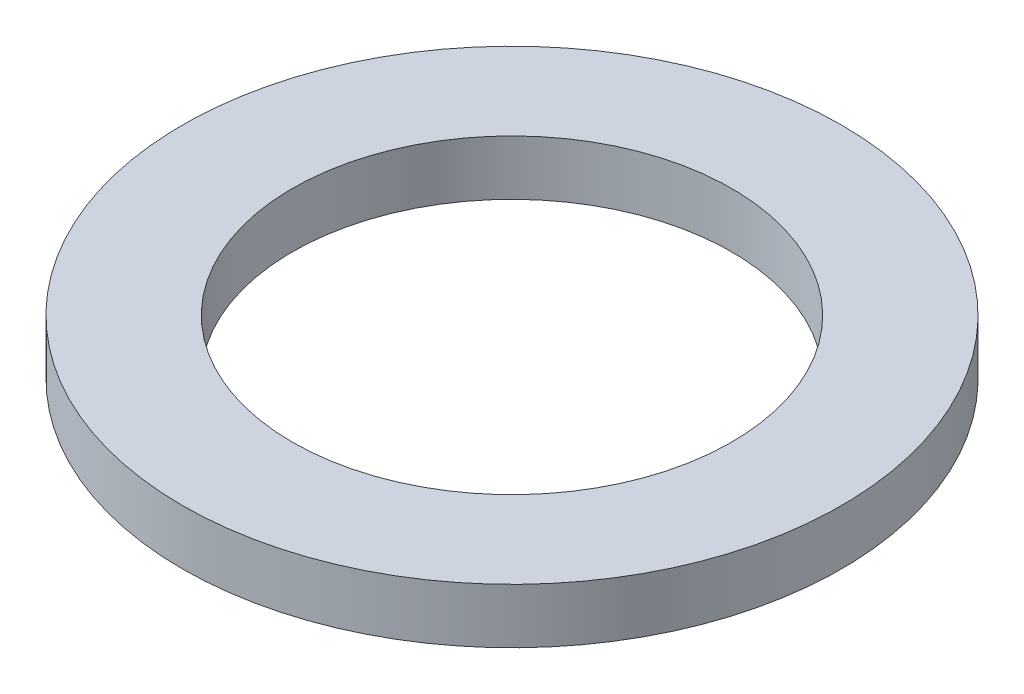
ISO-10303-21;
HEADER;
FILE_DESCRIPTION(('STEP AP214'),'2;1');
FILE_NAME('part.step','',(''),(''),'','','');
FILE_SCHEMA(('AUTOMOTIVE_DESIGN { 1 0 10303 214 1 1 1 1 }'));
ENDSEC;
DATA;
#1=APPLICATION_CONTEXT('core data for automotive mechanical design processes');
#2=APPLICATION_PROTOCOL_DEFINITION('international standard','automotive_design',2000,#1);
#3=PRODUCT_CONTEXT('',#1,'mechanical');
#4=PRODUCT('Part','Part','',(#3));
#5=PRODUCT_RELATED_PRODUCT_CATEGORY('part','',(#4));
#6=PRODUCT_DEFINITION_FORMATION('','',#4);
#7=PRODUCT_DEFINITION_CONTEXT('part definition',#1,'design');
#8=PRODUCT_DEFINITION('design','',#6,#7);
#9=PRODUCT_DEFINITION_SHAPE('','',#8);
#10=(LENGTH_UNIT() NAMED_UNIT(*) SI_UNIT(.MILLI.,.METRE.));
#11=(NAMED_UNIT(*) PLANE_ANGLE_UNIT() SI_UNIT($,.RADIAN.));
#12=(NAMED_UNIT(*) SI_UNIT($,.STERADIAN.) SOLID_ANGLE_UNIT());
#13=UNCERTAINTY_MEASURE_WITH_UNIT(LENGTH_MEASURE(1.E-05),#10,'distance_accuracy_value','');
#14=(GEOMETRIC_REPRESENTATION_CONTEXT(3) GLOBAL_UNCERTAINTY_ASSIGNED_CONTEXT((#13)) GLOBAL_UNIT_ASSIGNED_CONTEXT((#10,
#11,#12)) REPRESENTATION_CONTEXT('',''));
#15=CARTESIAN_POINT('',(0.,0.,0.));
#16=DIRECTION('',(0.,0.,1.));
#17=DIRECTION('',(1.,0.,0.));
#18=AXIS2_PLACEMENT_3D('',#15,#16,#17);
#19=CARTESIAN_POINT('',(0.,5.,0.));
#20=DIRECTION('',(0.,1.,0.));
#21=DIRECTION('',(0.,0.,1.));
#22=AXIS2_PLACEMENT_3D('',#19,#20,#21);
#23=PLANE('',#22);
#24=CARTESIAN_POINT('',(0.,5.,0.));
#25=DIRECTION('',(0.,1.,0.));
#26=DIRECTION('',(0.,0.,1.));
#27=AXIS2_PLACEMENT_3D('',#24,#25,#26);
#28=CIRCLE('',#27,30.);
#29=CARTESIAN_POINT('',(0.,5.,30.));
#30=VERTEX_POINT('',#29);
#31=EDGE_CURVE('E10',#30,#30,#28,.T.);
#32=ORIENTED_EDGE('',*,*,#31,.T.);
#33=EDGE_LOOP('',(#32));
#34=FACE_BOUND('',#33,.T.);
#35=CARTESIAN_POINT('',(0.,5.,0.));
#36=DIRECTION('',(0.,1.,0.));
#37=DIRECTION('',(0.,0.,1.));
#38=AXIS2_PLACEMENT_3D('',#35,#36,#37);
#39=CIRCLE('',#38,20.);
#40=CARTESIAN_POINT('',(0.,5.,20.));
#41=VERTEX_POINT('',#40);
#42=EDGE_CURVE('E41',#41,#41,#39,.T.);
#43=ORIENTED_EDGE('',*,*,#42,.F.);
#44=EDGE_LOOP('',(#43));
#45=FACE_BOUND('',#44,.T.);
#46=ADVANCED_FACE('F30',(#34,#45),#23,.T.);
#47=CARTESIAN_POINT('',(0.,0.,0.));
#48=DIRECTION('',(0.,1.,0.));
#49=DIRECTION('',(0.,0.,1.));
#50=AXIS2_PLACEMENT_3D('',#47,#48,#49);
#51=PLANE('',#50);
#52=CARTESIAN_POINT('',(0.,0.,0.));
#53=DIRECTION('',(0.,1.,0.));
#54=DIRECTION('',(0.,0.,1.));
#55=AXIS2_PLACEMENT_3D('',#52,#53,#54);
#56=CIRCLE('',#55,30.);
#57=CARTESIAN_POINT('',(0.,0.,30.));
#58=VERTEX_POINT('',#57);
#59=EDGE_CURVE('E34',#58,#58,#56,.T.);
#60=ORIENTED_EDGE('',*,*,#59,.F.);
#61=EDGE_LOOP('',(#60));
#62=FACE_BOUND('',#61,.T.);
#63=CARTESIAN_POINT('',(0.,0.,0.));
#64=DIRECTION('',(0.,1.,0.));
#65=DIRECTION('',(0.,0.,1.));
#66=AXIS2_PLACEMENT_3D('',#63,#64,#65);
#67=CIRCLE('',#66,20.);
#68=CARTESIAN_POINT('',(0.,0.,20.));
#69=VERTEX_POINT('',#68);
#70=EDGE_CURVE('E43',#69,#69,#67,.T.);
#71=ORIENTED_EDGE('',*,*,#70,.T.);
#72=EDGE_LOOP('',(#71));
#73=FACE_BOUND('',#72,.T.);
#74=ADVANCED_FACE('F53',(#62,#73),#51,.F.);
#75=CARTESIAN_POINT('',(0.,5.,0.));
#76=DIRECTION('',(0.,-1.,0.));
#77=DIRECTION('',(0.,0.,-1.));
#78=AXIS2_PLACEMENT_3D('',#75,#76,#77);
#79=CYLINDRICAL_SURFACE('',#78,30.);
#80=ORIENTED_EDGE('',*,*,#31,.F.);
#81=EDGE_LOOP('',(#80));
#82=FACE_BOUND('',#81,.T.);
#83=ORIENTED_EDGE('',*,*,#59,.T.);
#84=EDGE_LOOP('',(#83));
#85=FACE_BOUND('',#84,.T.);
#86=ADVANCED_FACE('F32',(#82,#85),#79,.T.);
#87=CARTESIAN_POINT('',(0.,5.,0.));
#88=DIRECTION('',(0.,-1.,0.));
#89=DIRECTION('',(0.,0.,-1.));
#90=AXIS2_PLACEMENT_3D('',#87,#88,#89);
#91=CYLINDRICAL_SURFACE('',#90,20.);
#92=ORIENTED_EDGE('',*,*,#42,.T.);
#93=EDGE_LOOP('',(#92));
#94=FACE_BOUND('',#93,.T.);
#95=ORIENTED_EDGE('',*,*,#70,.F.);
#96=EDGE_LOOP('',(#95));
#97=FACE_BOUND('',#96,.T.);
#98=ADVANCED_FACE('F49',(#94,#97),#91,.F.);
#99=CLOSED_SHELL('',(#46,#74,#86,#98));
#100=MANIFOLD_SOLID_BREP('B2',#99);
#101=ADVANCED_BREP_SHAPE_REPRESENTATION('',(#18,#100),#14);
#102=SHAPE_DEFINITION_REPRESENTATION(#9,#101);
ENDSEC;
END-ISO-10303-21;
